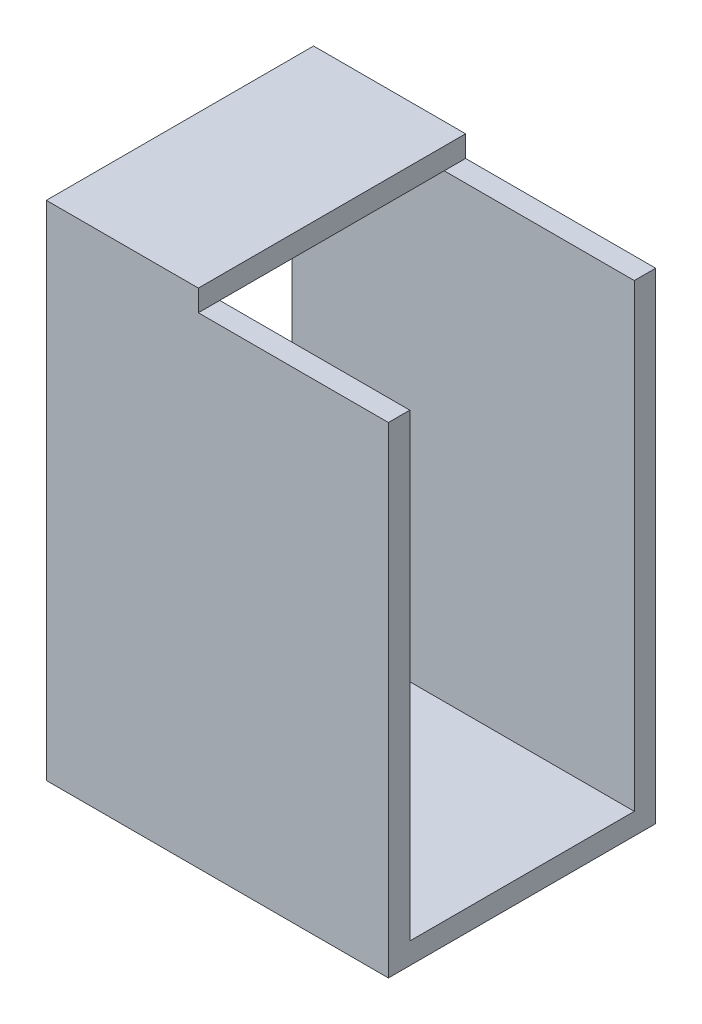
ISO-10303-21;
HEADER;
FILE_DESCRIPTION(('STEP AP214'),'2;1');
FILE_NAME('part.step','',(''),(''),'','','');
FILE_SCHEMA(('AUTOMOTIVE_DESIGN { 1 0 10303 214 1 1 1 1 }'));
ENDSEC;
DATA;
#1=APPLICATION_CONTEXT('core data for automotive mechanical design processes');
#2=APPLICATION_PROTOCOL_DEFINITION('international standard','automotive_design',2000,#1);
#3=PRODUCT_CONTEXT('',#1,'mechanical');
#4=PRODUCT('Part','Part','',(#3));
#5=PRODUCT_RELATED_PRODUCT_CATEGORY('part','',(#4));
#6=PRODUCT_DEFINITION_FORMATION('','',#4);
#7=PRODUCT_DEFINITION_CONTEXT('part definition',#1,'design');
#8=PRODUCT_DEFINITION('design','',#6,#7);
#9=PRODUCT_DEFINITION_SHAPE('','',#8);
#10=(LENGTH_UNIT() NAMED_UNIT(*) SI_UNIT(.MILLI.,.METRE.));
#11=(NAMED_UNIT(*) PLANE_ANGLE_UNIT() SI_UNIT($,.RADIAN.));
#12=(NAMED_UNIT(*) SI_UNIT($,.STERADIAN.) SOLID_ANGLE_UNIT());
#13=UNCERTAINTY_MEASURE_WITH_UNIT(LENGTH_MEASURE(1.E-05),#10,'distance_accuracy_value','');
#14=(GEOMETRIC_REPRESENTATION_CONTEXT(3) GLOBAL_UNCERTAINTY_ASSIGNED_CONTEXT((#13)) GLOBAL_UNIT_ASSIGNED_CONTEXT((#10,
#11,#12)) REPRESENTATION_CONTEXT('',''));
#15=CARTESIAN_POINT('',(0.,0.,0.));
#16=DIRECTION('',(0.,0.,1.));
#17=DIRECTION('',(1.,0.,0.));
#18=AXIS2_PLACEMENT_3D('',#15,#16,#17);
#19=CARTESIAN_POINT('',(0.,225.,105.));
#20=DIRECTION('',(0.,-1.,0.));
#21=DIRECTION('',(0.,0.,-1.));
#22=AXIS2_PLACEMENT_3D('',#19,#20,#21);
#23=PLANE('',#22);
#24=DIRECTION('',(0.,0.,-1.));
#25=VECTOR('',#24,1.);
#26=CARTESIAN_POINT('',(71.1,225.,115.));
#27=LINE('',#26,#25);
#28=CARTESIAN_POINT('',(71.1,225.,115.));
#29=VERTEX_POINT('',#28);
#30=CARTESIAN_POINT('',(71.1,225.,-10.));
#31=VERTEX_POINT('',#30);
#32=EDGE_CURVE('E142',#29,#31,#27,.T.);
#33=ORIENTED_EDGE('',*,*,#32,.T.);
#34=DIRECTION('',(-1.,0.,0.));
#35=VECTOR('',#34,1.);
#36=CARTESIAN_POINT('',(0.,225.,-10.));
#37=LINE('',#36,#35);
#38=CARTESIAN_POINT('',(0.,225.,-10.));
#39=VERTEX_POINT('',#38);
#40=EDGE_CURVE('E138',#31,#39,#37,.T.);
#41=ORIENTED_EDGE('',*,*,#40,.T.);
#42=DIRECTION('',(0.,0.,-1.));
#43=VECTOR('',#42,1.);
#44=CARTESIAN_POINT('',(0.,225.,105.));
#45=LINE('',#44,#43);
#46=CARTESIAN_POINT('',(0.,225.,115.));
#47=VERTEX_POINT('',#46);
#48=EDGE_CURVE('E186',#47,#39,#45,.T.);
#49=ORIENTED_EDGE('',*,*,#48,.F.);
#50=DIRECTION('',(-1.,0.,0.));
#51=VECTOR('',#50,1.);
#52=CARTESIAN_POINT('',(0.,225.,115.));
#53=LINE('',#52,#51);
#54=EDGE_CURVE('E184',#29,#47,#53,.T.);
#55=ORIENTED_EDGE('',*,*,#54,.F.);
#56=EDGE_LOOP('',(#33,#41,#49,#55));
#57=FACE_BOUND('',#56,.T.);
#58=ADVANCED_FACE('F32',(#57),#23,.F.);
#59=CARTESIAN_POINT('',(0.,215.,105.));
#60=DIRECTION('',(0.,-1.,0.));
#61=DIRECTION('',(0.,0.,-1.));
#62=AXIS2_PLACEMENT_3D('',#59,#60,#61);
#63=PLANE('',#62);
#64=DIRECTION('',(-1.,0.,0.));
#65=VECTOR('',#64,1.);
#66=CARTESIAN_POINT('',(0.,215.,0.));
#67=LINE('',#66,#65);
#68=CARTESIAN_POINT('',(71.1,215.,0.));
#69=VERTEX_POINT('',#68);
#70=CARTESIAN_POINT('',(0.,215.,0.));
#71=VERTEX_POINT('',#70);
#72=EDGE_CURVE('E167',#69,#71,#67,.T.);
#73=ORIENTED_EDGE('',*,*,#72,.F.);
#74=DIRECTION('',(0.,0.,-1.));
#75=VECTOR('',#74,1.);
#76=CARTESIAN_POINT('',(71.1,215.,115.));
#77=LINE('',#76,#75);
#78=CARTESIAN_POINT('',(71.1,215.,105.));
#79=VERTEX_POINT('',#78);
#80=EDGE_CURVE('E49',#79,#69,#77,.T.);
#81=ORIENTED_EDGE('',*,*,#80,.F.);
#82=DIRECTION('',(-1.,0.,0.));
#83=VECTOR('',#82,1.);
#84=CARTESIAN_POINT('',(0.,215.,105.));
#85=LINE('',#84,#83);
#86=CARTESIAN_POINT('',(0.,215.,105.));
#87=VERTEX_POINT('',#86);
#88=EDGE_CURVE('E56',#79,#87,#85,.T.);
#89=ORIENTED_EDGE('',*,*,#88,.T.);
#90=DIRECTION('',(0.,0.,-1.));
#91=VECTOR('',#90,1.);
#92=CARTESIAN_POINT('',(0.,215.,105.));
#93=LINE('',#92,#91);
#94=EDGE_CURVE('E157',#87,#71,#93,.T.);
#95=ORIENTED_EDGE('',*,*,#94,.T.);
#96=EDGE_LOOP('',(#73,#81,#89,#95));
#97=FACE_BOUND('',#96,.T.);
#98=ADVANCED_FACE('F216',(#97),#63,.T.);
#99=CARTESIAN_POINT('',(0.,0.,105.));
#100=DIRECTION('',(1.,0.,0.));
#101=DIRECTION('',(0.,0.,-1.));
#102=AXIS2_PLACEMENT_3D('',#99,#100,#101);
#103=PLANE('',#102);
#104=DIRECTION('',(0.,-1.,0.));
#105=VECTOR('',#104,1.);
#106=CARTESIAN_POINT('',(0.,0.,-10.));
#107=LINE('',#106,#105);
#108=CARTESIAN_POINT('',(0.,-10.,-10.));
#109=VERTEX_POINT('',#108);
#110=EDGE_CURVE('E36',#39,#109,#107,.T.);
#111=ORIENTED_EDGE('',*,*,#110,.T.);
#112=DIRECTION('',(0.,0.,-1.));
#113=VECTOR('',#112,1.);
#114=CARTESIAN_POINT('',(0.,-10.,105.));
#115=LINE('',#114,#113);
#116=CARTESIAN_POINT('',(0.,-10.,115.));
#117=VERTEX_POINT('',#116);
#118=EDGE_CURVE('E11',#117,#109,#115,.T.);
#119=ORIENTED_EDGE('',*,*,#118,.F.);
#120=DIRECTION('',(0.,-1.,0.));
#121=VECTOR('',#120,1.);
#122=CARTESIAN_POINT('',(0.,0.,115.));
#123=LINE('',#122,#121);
#124=EDGE_CURVE('E183',#47,#117,#123,.T.);
#125=ORIENTED_EDGE('',*,*,#124,.F.);
#126=ORIENTED_EDGE('',*,*,#48,.T.);
#127=EDGE_LOOP('',(#111,#119,#125,#126));
#128=FACE_BOUND('',#127,.T.);
#129=DIRECTION('',(0.,-1.,0.));
#130=VECTOR('',#129,1.);
#131=CARTESIAN_POINT('',(0.,0.,0.));
#132=LINE('',#131,#130);
#133=CARTESIAN_POINT('',(0.,0.,0.));
#134=VERTEX_POINT('',#133);
#135=EDGE_CURVE('E158',#71,#134,#132,.T.);
#136=ORIENTED_EDGE('',*,*,#135,.F.);
#137=ORIENTED_EDGE('',*,*,#94,.F.);
#138=DIRECTION('',(0.,-1.,0.));
#139=VECTOR('',#138,1.);
#140=CARTESIAN_POINT('',(0.,0.,105.));
#141=LINE('',#140,#139);
#142=CARTESIAN_POINT('',(0.,0.,105.));
#143=VERTEX_POINT('',#142);
#144=EDGE_CURVE('E145',#87,#143,#141,.T.);
#145=ORIENTED_EDGE('',*,*,#144,.T.);
#146=DIRECTION('',(0.,0.,-1.));
#147=VECTOR('',#146,1.);
#148=CARTESIAN_POINT('',(0.,0.,105.));
#149=LINE('',#148,#147);
#150=EDGE_CURVE('E174',#143,#134,#149,.T.);
#151=ORIENTED_EDGE('',*,*,#150,.T.);
#152=EDGE_LOOP('',(#136,#137,#145,#151));
#153=FACE_BOUND('',#152,.T.);
#154=ADVANCED_FACE('F199',(#128,#153),#103,.F.);
#155=CARTESIAN_POINT('',(160.,0.,105.));
#156=DIRECTION('',(-1.,0.,0.));
#157=DIRECTION('',(0.,0.,1.));
#158=AXIS2_PLACEMENT_3D('',#155,#156,#157);
#159=PLANE('',#158);
#160=DIRECTION('',(0.,1.,0.));
#161=VECTOR('',#160,1.);
#162=CARTESIAN_POINT('',(160.,0.,-10.));
#163=LINE('',#162,#161);
#164=CARTESIAN_POINT('',(160.,-10.,-10.));
#165=VERTEX_POINT('',#164);
#166=CARTESIAN_POINT('',(160.,215.,-10.));
#167=VERTEX_POINT('',#166);
#168=EDGE_CURVE('E179',#165,#167,#163,.T.);
#169=ORIENTED_EDGE('',*,*,#168,.T.);
#170=DIRECTION('',(0.,0.,-1.));
#171=VECTOR('',#170,1.);
#172=CARTESIAN_POINT('',(160.,215.,115.));
#173=LINE('',#172,#171);
#174=CARTESIAN_POINT('',(160.,215.,0.));
#175=VERTEX_POINT('',#174);
#176=EDGE_CURVE('E131',#175,#167,#173,.T.);
#177=ORIENTED_EDGE('',*,*,#176,.F.);
#178=DIRECTION('',(0.,1.,0.));
#179=VECTOR('',#178,1.);
#180=CARTESIAN_POINT('',(160.,0.,0.));
#181=LINE('',#180,#179);
#182=CARTESIAN_POINT('',(160.,0.,0.));
#183=VERTEX_POINT('',#182);
#184=EDGE_CURVE('E164',#183,#175,#181,.T.);
#185=ORIENTED_EDGE('',*,*,#184,.F.);
#186=DIRECTION('',(0.,0.,-1.));
#187=VECTOR('',#186,1.);
#188=CARTESIAN_POINT('',(160.,0.,105.));
#189=LINE('',#188,#187);
#190=CARTESIAN_POINT('',(160.,0.,105.));
#191=VERTEX_POINT('',#190);
#192=EDGE_CURVE('E171',#191,#183,#189,.T.);
#193=ORIENTED_EDGE('',*,*,#192,.F.);
#194=DIRECTION('',(0.,1.,0.));
#195=VECTOR('',#194,1.);
#196=CARTESIAN_POINT('',(160.,0.,105.));
#197=LINE('',#196,#195);
#198=CARTESIAN_POINT('',(160.,215.,105.));
#199=VERTEX_POINT('',#198);
#200=EDGE_CURVE('E152',#191,#199,#197,.T.);
#201=ORIENTED_EDGE('',*,*,#200,.T.);
#202=CARTESIAN_POINT('',(160.,215.,115.));
#203=VERTEX_POINT('',#202);
#204=EDGE_CURVE('E162',#203,#199,#173,.T.);
#205=ORIENTED_EDGE('',*,*,#204,.F.);
#206=DIRECTION('',(0.,1.,0.));
#207=VECTOR('',#206,1.);
#208=CARTESIAN_POINT('',(160.,0.,115.));
#209=LINE('',#208,#207);
#210=CARTESIAN_POINT('',(160.,-10.,115.));
#211=VERTEX_POINT('',#210);
#212=EDGE_CURVE('E182',#211,#203,#209,.T.);
#213=ORIENTED_EDGE('',*,*,#212,.F.);
#214=DIRECTION('',(0.,0.,-1.));
#215=VECTOR('',#214,1.);
#216=CARTESIAN_POINT('',(160.,-10.,105.));
#217=LINE('',#216,#215);
#218=EDGE_CURVE('E41',#211,#165,#217,.T.);
#219=ORIENTED_EDGE('',*,*,#218,.T.);
#220=EDGE_LOOP('',(#169,#177,#185,#193,#201,#205,#213,#219));
#221=FACE_BOUND('',#220,.T.);
#222=ADVANCED_FACE('F227',(#221),#159,.F.);
#223=CARTESIAN_POINT('',(0.,-10.,105.));
#224=DIRECTION('',(0.,1.,0.));
#225=DIRECTION('',(0.,0.,1.));
#226=AXIS2_PLACEMENT_3D('',#223,#224,#225);
#227=PLANE('',#226);
#228=DIRECTION('',(1.,0.,0.));
#229=VECTOR('',#228,1.);
#230=CARTESIAN_POINT('',(0.,-10.,-10.));
#231=LINE('',#230,#229);
#232=EDGE_CURVE('E177',#109,#165,#231,.T.);
#233=ORIENTED_EDGE('',*,*,#232,.T.);
#234=ORIENTED_EDGE('',*,*,#218,.F.);
#235=DIRECTION('',(1.,0.,0.));
#236=VECTOR('',#235,1.);
#237=CARTESIAN_POINT('',(0.,-10.,115.));
#238=LINE('',#237,#236);
#239=EDGE_CURVE('E180',#117,#211,#238,.T.);
#240=ORIENTED_EDGE('',*,*,#239,.F.);
#241=ORIENTED_EDGE('',*,*,#118,.T.);
#242=EDGE_LOOP('',(#233,#234,#240,#241));
#243=FACE_BOUND('',#242,.T.);
#244=ADVANCED_FACE('F206',(#243),#227,.F.);
#245=CARTESIAN_POINT('',(0.,0.,115.));
#246=DIRECTION('',(0.,0.,-1.));
#247=DIRECTION('',(-1.,0.,0.));
#248=AXIS2_PLACEMENT_3D('',#245,#246,#247);
#249=PLANE('',#248);
#250=ORIENTED_EDGE('',*,*,#212,.T.);
#251=DIRECTION('',(-1.,0.,0.));
#252=VECTOR('',#251,1.);
#253=CARTESIAN_POINT('',(160.,215.,115.));
#254=LINE('',#253,#252);
#255=CARTESIAN_POINT('',(71.1,215.,115.));
#256=VERTEX_POINT('',#255);
#257=EDGE_CURVE('E124',#203,#256,#254,.T.);
#258=ORIENTED_EDGE('',*,*,#257,.T.);
#259=DIRECTION('',(0.,1.,0.));
#260=VECTOR('',#259,1.);
#261=CARTESIAN_POINT('',(71.1,61.6109195542264,115.));
#262=LINE('',#261,#260);
#263=EDGE_CURVE('E139',#256,#29,#262,.T.);
#264=ORIENTED_EDGE('',*,*,#263,.T.);
#265=ORIENTED_EDGE('',*,*,#54,.T.);
#266=ORIENTED_EDGE('',*,*,#124,.T.);
#267=ORIENTED_EDGE('',*,*,#239,.T.);
#268=EDGE_LOOP('',(#250,#258,#264,#265,#266,#267));
#269=FACE_BOUND('',#268,.T.);
#270=ADVANCED_FACE('F209',(#269),#249,.F.);
#271=CARTESIAN_POINT('',(0.,0.,-10.));
#272=DIRECTION('',(0.,0.,-1.));
#273=DIRECTION('',(-1.,0.,0.));
#274=AXIS2_PLACEMENT_3D('',#271,#272,#273);
#275=PLANE('',#274);
#276=DIRECTION('',(-1.,0.,0.));
#277=VECTOR('',#276,1.);
#278=CARTESIAN_POINT('',(160.,215.,-10.));
#279=LINE('',#278,#277);
#280=CARTESIAN_POINT('',(71.1,215.,-10.));
#281=VERTEX_POINT('',#280);
#282=EDGE_CURVE('E128',#167,#281,#279,.T.);
#283=ORIENTED_EDGE('',*,*,#282,.F.);
#284=ORIENTED_EDGE('',*,*,#168,.F.);
#285=ORIENTED_EDGE('',*,*,#232,.F.);
#286=ORIENTED_EDGE('',*,*,#110,.F.);
#287=ORIENTED_EDGE('',*,*,#40,.F.);
#288=DIRECTION('',(0.,1.,0.));
#289=VECTOR('',#288,1.);
#290=CARTESIAN_POINT('',(71.1,61.6109195542264,-10.));
#291=LINE('',#290,#289);
#292=EDGE_CURVE('E120',#281,#31,#291,.T.);
#293=ORIENTED_EDGE('',*,*,#292,.F.);
#294=EDGE_LOOP('',(#283,#284,#285,#286,#287,#293));
#295=FACE_BOUND('',#294,.T.);
#296=ADVANCED_FACE('F34',(#295),#275,.T.);
#297=CARTESIAN_POINT('',(0.,0.,105.));
#298=DIRECTION('',(0.,1.,0.));
#299=DIRECTION('',(0.,0.,1.));
#300=AXIS2_PLACEMENT_3D('',#297,#298,#299);
#301=PLANE('',#300);
#302=DIRECTION('',(1.,0.,0.));
#303=VECTOR('',#302,1.);
#304=CARTESIAN_POINT('',(0.,0.,0.));
#305=LINE('',#304,#303);
#306=EDGE_CURVE('E161',#134,#183,#305,.T.);
#307=ORIENTED_EDGE('',*,*,#306,.F.);
#308=ORIENTED_EDGE('',*,*,#150,.F.);
#309=DIRECTION('',(1.,0.,0.));
#310=VECTOR('',#309,1.);
#311=CARTESIAN_POINT('',(0.,0.,105.));
#312=LINE('',#311,#310);
#313=EDGE_CURVE('E148',#143,#191,#312,.T.);
#314=ORIENTED_EDGE('',*,*,#313,.T.);
#315=ORIENTED_EDGE('',*,*,#192,.T.);
#316=EDGE_LOOP('',(#307,#308,#314,#315));
#317=FACE_BOUND('',#316,.T.);
#318=ADVANCED_FACE('F252',(#317),#301,.T.);
#319=CARTESIAN_POINT('',(0.,0.,105.));
#320=DIRECTION('',(0.,0.,-1.));
#321=DIRECTION('',(-1.,0.,0.));
#322=AXIS2_PLACEMENT_3D('',#319,#320,#321);
#323=PLANE('',#322);
#324=ORIENTED_EDGE('',*,*,#144,.F.);
#325=ORIENTED_EDGE('',*,*,#88,.F.);
#326=EDGE_CURVE('E155',#199,#79,#85,.T.);
#327=ORIENTED_EDGE('',*,*,#326,.F.);
#328=ORIENTED_EDGE('',*,*,#200,.F.);
#329=ORIENTED_EDGE('',*,*,#313,.F.);
#330=EDGE_LOOP('',(#324,#325,#327,#328,#329));
#331=FACE_BOUND('',#330,.T.);
#332=ADVANCED_FACE('F219',(#331),#323,.T.);
#333=CARTESIAN_POINT('',(0.,0.,0.));
#334=DIRECTION('',(0.,0.,-1.));
#335=DIRECTION('',(-1.,0.,0.));
#336=AXIS2_PLACEMENT_3D('',#333,#334,#335);
#337=PLANE('',#336);
#338=ORIENTED_EDGE('',*,*,#135,.T.);
#339=ORIENTED_EDGE('',*,*,#306,.T.);
#340=ORIENTED_EDGE('',*,*,#184,.T.);
#341=EDGE_CURVE('E149',#175,#69,#67,.T.);
#342=ORIENTED_EDGE('',*,*,#341,.T.);
#343=ORIENTED_EDGE('',*,*,#72,.T.);
#344=EDGE_LOOP('',(#338,#339,#340,#342,#343));
#345=FACE_BOUND('',#344,.T.);
#346=ADVANCED_FACE('F224',(#345),#337,.F.);
#347=CARTESIAN_POINT('',(0.,215.,105.));
#348=DIRECTION('',(0.,-1.,0.));
#349=DIRECTION('',(0.,0.,-1.));
#350=AXIS2_PLACEMENT_3D('',#347,#348,#349);
#351=PLANE('',#350);
#352=ORIENTED_EDGE('',*,*,#176,.T.);
#353=ORIENTED_EDGE('',*,*,#282,.T.);
#354=EDGE_CURVE('E116',#69,#281,#77,.T.);
#355=ORIENTED_EDGE('',*,*,#354,.F.);
#356=ORIENTED_EDGE('',*,*,#341,.F.);
#357=EDGE_LOOP('',(#352,#353,#355,#356));
#358=FACE_BOUND('',#357,.T.);
#359=ADVANCED_FACE('F129',(#358),#351,.F.);
#360=ORIENTED_EDGE('',*,*,#326,.T.);
#361=EDGE_CURVE('E126',#256,#79,#77,.T.);
#362=ORIENTED_EDGE('',*,*,#361,.F.);
#363=ORIENTED_EDGE('',*,*,#257,.F.);
#364=ORIENTED_EDGE('',*,*,#204,.T.);
#365=EDGE_LOOP('',(#360,#362,#363,#364));
#366=FACE_BOUND('',#365,.T.);
#367=ADVANCED_FACE('F230',(#366),#351,.F.);
#368=CARTESIAN_POINT('',(71.1,61.6109195542264,115.));
#369=DIRECTION('',(1.,0.,0.));
#370=DIRECTION('',(0.,0.,-1.));
#371=AXIS2_PLACEMENT_3D('',#368,#369,#370);
#372=PLANE('',#371);
#373=ORIENTED_EDGE('',*,*,#361,.T.);
#374=ORIENTED_EDGE('',*,*,#80,.T.);
#375=ORIENTED_EDGE('',*,*,#354,.T.);
#376=ORIENTED_EDGE('',*,*,#292,.T.);
#377=ORIENTED_EDGE('',*,*,#32,.F.);
#378=ORIENTED_EDGE('',*,*,#263,.F.);
#379=EDGE_LOOP('',(#373,#374,#375,#376,#377,#378));
#380=FACE_BOUND('',#379,.T.);
#381=ADVANCED_FACE('F118',(#380),#372,.T.);
#382=CLOSED_SHELL('',(#58,#98,#154,#222,#244,#270,#296,#318,#332,#346,#359,#367,#381));
#383=MANIFOLD_SOLID_BREP('B2',#382);
#384=ADVANCED_BREP_SHAPE_REPRESENTATION('',(#18,#383),#14);
#385=SHAPE_DEFINITION_REPRESENTATION(#9,#384);
ENDSEC;
END-ISO-10303-21;
